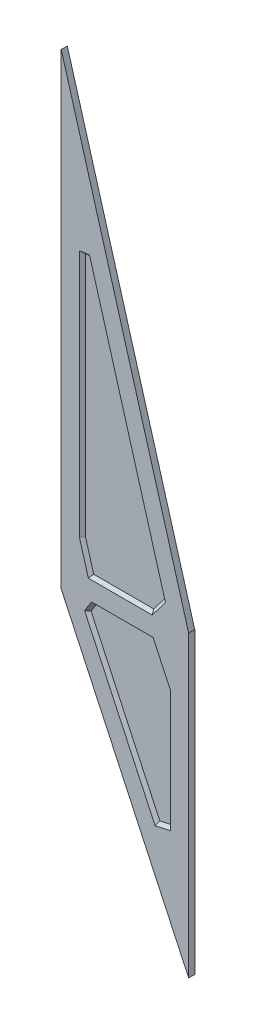
ISO-10303-21;
HEADER;
FILE_DESCRIPTION(('STEP AP214'),'2;1');
FILE_NAME('part.step','',(''),(''),'','','');
FILE_SCHEMA(('AUTOMOTIVE_DESIGN { 1 0 10303 214 1 1 1 1 }'));
ENDSEC;
DATA;
#1=APPLICATION_CONTEXT('core data for automotive mechanical design processes');
#2=APPLICATION_PROTOCOL_DEFINITION('international standard','automotive_design',2000,#1);
#3=PRODUCT_CONTEXT('',#1,'mechanical');
#4=PRODUCT('Part','Part','',(#3));
#5=PRODUCT_RELATED_PRODUCT_CATEGORY('part','',(#4));
#6=PRODUCT_DEFINITION_FORMATION('','',#4);
#7=PRODUCT_DEFINITION_CONTEXT('part definition',#1,'design');
#8=PRODUCT_DEFINITION('design','',#6,#7);
#9=PRODUCT_DEFINITION_SHAPE('','',#8);
#10=(LENGTH_UNIT() NAMED_UNIT(*) SI_UNIT(.MILLI.,.METRE.));
#11=(NAMED_UNIT(*) PLANE_ANGLE_UNIT() SI_UNIT($,.RADIAN.));
#12=(NAMED_UNIT(*) SI_UNIT($,.STERADIAN.) SOLID_ANGLE_UNIT());
#13=UNCERTAINTY_MEASURE_WITH_UNIT(LENGTH_MEASURE(1.E-05),#10,'distance_accuracy_value','');
#14=(GEOMETRIC_REPRESENTATION_CONTEXT(3) GLOBAL_UNCERTAINTY_ASSIGNED_CONTEXT((#13)) GLOBAL_UNIT_ASSIGNED_CONTEXT((#10,
#11,#12)) REPRESENTATION_CONTEXT('',''));
#15=CARTESIAN_POINT('',(0.,0.,0.));
#16=DIRECTION('',(0.,0.,1.));
#17=DIRECTION('',(1.,0.,0.));
#18=AXIS2_PLACEMENT_3D('',#15,#16,#17);
#19=CARTESIAN_POINT('',(0.,0.,10.));
#20=DIRECTION('',(0.,0.,1.));
#21=DIRECTION('',(1.,0.,0.));
#22=AXIS2_PLACEMENT_3D('',#19,#20,#21);
#23=PLANE('',#22);
#24=DIRECTION('',(0.,-1.,0.));
#25=VECTOR('',#24,1.);
#26=CARTESIAN_POINT('',(0.,-450.,10.));
#27=LINE('',#26,#25);
#28=CARTESIAN_POINT('',(0.,42.1417075551608,10.));
#29=VERTEX_POINT('',#28);
#30=CARTESIAN_POINT('',(0.,-450.,10.));
#31=VERTEX_POINT('',#30);
#32=EDGE_CURVE('E158',#29,#31,#27,.T.);
#33=ORIENTED_EDGE('',*,*,#32,.F.);
#34=DIRECTION('',(0.277210869934193,-0.960809103615452,0.));
#35=VECTOR('',#34,1.);
#36=CARTESIAN_POINT('',(11.2243058966378,3.23841602905938,10.));
#37=LINE('',#36,#35);
#38=CARTESIAN_POINT('',(-210.,769.998850412304,10.));
#39=VERTEX_POINT('',#38);
#40=EDGE_CURVE('E185',#39,#29,#37,.T.);
#41=ORIENTED_EDGE('',*,*,#40,.F.);
#42=DIRECTION('',(0.,-1.,0.));
#43=VECTOR('',#42,1.);
#44=CARTESIAN_POINT('',(-209.999999999999,0.,10.));
#45=LINE('',#44,#43);
#46=CARTESIAN_POINT('',(-209.999999999999,0.,10.));
#47=VERTEX_POINT('',#46);
#48=EDGE_CURVE('E268',#39,#47,#45,.T.);
#49=ORIENTED_EDGE('',*,*,#48,.T.);
#50=DIRECTION('',(-0.422885465331123,0.906183139995266,0.));
#51=VECTOR('',#50,1.);
#52=CARTESIAN_POINT('',(-172.445255474452,-80.4744525547442,10.));
#53=LINE('',#52,#51);
#54=EDGE_CURVE('E189',#31,#47,#53,.T.);
#55=ORIENTED_EDGE('',*,*,#54,.F.);
#56=EDGE_LOOP('',(#33,#41,#49,#55));
#57=FACE_BOUND('',#56,.T.);
#58=DIRECTION('',(1.,0.,0.));
#59=VECTOR('',#58,1.);
#60=CARTESIAN_POINT('',(-160.,6.6554801024863,10.));
#61=LINE('',#60,#59);
#62=CARTESIAN_POINT('',(-160.,6.6554801024863,10.));
#63=VERTEX_POINT('',#62);
#64=CARTESIAN_POINT('',(-58.6117340468559,6.65548010248633,10.));
#65=VERTEX_POINT('',#64);
#66=EDGE_CURVE('E237',#63,#65,#61,.T.);
#67=ORIENTED_EDGE('',*,*,#66,.T.);
#68=DIRECTION('',(0.422885465331123,-0.906183139995266,0.));
#69=VECTOR('',#68,1.);
#70=CARTESIAN_POINT('',(-58.6117340468559,6.65548010248632,10.));
#71=LINE('',#70,#69);
#72=CARTESIAN_POINT('',(-30.,-54.6553785693479,10.));
#73=VERTEX_POINT('',#72);
#74=EDGE_CURVE('E280',#65,#73,#71,.T.);
#75=ORIENTED_EDGE('',*,*,#74,.T.);
#76=DIRECTION('',(0.,-1.,0.));
#77=VECTOR('',#76,1.);
#78=CARTESIAN_POINT('',(-30.,-54.6553785693479,10.));
#79=LINE('',#78,#77);
#80=CARTESIAN_POINT('',(-30.,-254.773091326085,10.));
#81=VERTEX_POINT('',#80);
#82=EDGE_CURVE('E283',#73,#81,#79,.T.);
#83=ORIENTED_EDGE('',*,*,#82,.T.);
#84=DIRECTION('',(-0.976264088245405,-0.216583540469647,0.));
#85=VECTOR('',#84,1.);
#86=CARTESIAN_POINT('',(-55.3731279198674,-260.402102926369,10.));
#87=LINE('',#86,#85);
#88=CARTESIAN_POINT('',(-55.3731279198674,-260.402102926369,10.));
#89=VERTEX_POINT('',#88);
#90=EDGE_CURVE('E286',#81,#89,#87,.T.);
#91=ORIENTED_EDGE('',*,*,#90,.T.);
#92=DIRECTION('',(-0.422885465331123,0.906183139995266,0.));
#93=VECTOR('',#92,1.);
#94=CARTESIAN_POINT('',(-55.3731279198674,-260.402102926369,10.));
#95=LINE('',#94,#93);
#96=CARTESIAN_POINT('',(-171.542290693377,-11.468182697419,10.));
#97=VERTEX_POINT('',#96);
#98=EDGE_CURVE('E289',#89,#97,#95,.T.);
#99=ORIENTED_EDGE('',*,*,#98,.T.);
#100=DIRECTION('',(0.53717526686775,0.843470647186707,0.));
#101=VECTOR('',#100,1.);
#102=CARTESIAN_POINT('',(-171.542290693377,-11.468182697419,10.));
#103=LINE('',#102,#101);
#104=EDGE_CURVE('E292',#97,#63,#103,.T.);
#105=ORIENTED_EDGE('',*,*,#104,.T.);
#106=EDGE_LOOP('',(#67,#75,#83,#91,#99,#105));
#107=FACE_BOUND('',#106,.T.);
#108=DIRECTION('',(0.277210869934193,-0.960809103615452,0.));
#109=VECTOR('',#108,1.);
#110=CARTESIAN_POINT('',(-163.367347803948,500.149847833662,10.));
#111=LINE('',#110,#109);
#112=CARTESIAN_POINT('',(-163.367347803948,500.149847833662,10.));
#113=VERTEX_POINT('',#112);
#114=CARTESIAN_POINT('',(-38.3163260980258,66.72470797538,10.));
#115=VERTEX_POINT('',#114);
#116=EDGE_CURVE('E263',#113,#115,#111,.T.);
#117=ORIENTED_EDGE('',*,*,#116,.T.);
#118=DIRECTION('',(-0.601161014232379,-0.799127921528898,0.));
#119=VECTOR('',#118,1.);
#120=CARTESIAN_POINT('',(-38.3163260980258,66.72470797538,10.));
#121=LINE('',#120,#119);
#122=CARTESIAN_POINT('',(-60.,37.9004348669165,10.));
#123=VERTEX_POINT('',#122);
#124=EDGE_CURVE('E261',#115,#123,#121,.T.);
#125=ORIENTED_EDGE('',*,*,#124,.T.);
#126=DIRECTION('',(-1.,0.,0.));
#127=VECTOR('',#126,1.);
#128=CARTESIAN_POINT('',(-60.,37.9004348669165,10.));
#129=LINE('',#128,#127);
#130=CARTESIAN_POINT('',(-165.302631408071,37.9004348669165,10.));
#131=VERTEX_POINT('',#130);
#132=EDGE_CURVE('E248',#123,#131,#129,.T.);
#133=ORIENTED_EDGE('',*,*,#132,.T.);
#134=DIRECTION('',(-0.277210869934193,0.960809103615451,0.));
#135=VECTOR('',#134,1.);
#136=CARTESIAN_POINT('',(-180.,88.8413144423438,10.));
#137=LINE('',#136,#135);
#138=CARTESIAN_POINT('',(-180.,88.8413144423438,10.));
#139=VERTEX_POINT('',#138);
#140=EDGE_CURVE('E254',#131,#139,#137,.T.);
#141=ORIENTED_EDGE('',*,*,#140,.T.);
#142=DIRECTION('',(0.,1.,0.));
#143=VECTOR('',#142,1.);
#144=CARTESIAN_POINT('',(-180.,88.8413144423438,10.));
#145=LINE('',#144,#143);
#146=CARTESIAN_POINT('',(-180.,497.798394050589,10.));
#147=VERTEX_POINT('',#146);
#148=EDGE_CURVE('E182',#139,#147,#145,.T.);
#149=ORIENTED_EDGE('',*,*,#148,.T.);
#150=DIRECTION('',(0.990153802097293,0.139983742599902,0.));
#151=VECTOR('',#150,1.);
#152=CARTESIAN_POINT('',(-180.,497.798394050589,10.));
#153=LINE('',#152,#151);
#154=EDGE_CURVE('E178',#147,#113,#153,.T.);
#155=ORIENTED_EDGE('',*,*,#154,.T.);
#156=EDGE_LOOP('',(#117,#125,#133,#141,#149,#155));
#157=FACE_BOUND('',#156,.T.);
#158=ADVANCED_FACE('F37',(#57,#107,#157),#23,.T.);
#159=CARTESIAN_POINT('',(0.,0.,0.));
#160=DIRECTION('',(0.,0.,1.));
#161=DIRECTION('',(1.,0.,0.));
#162=AXIS2_PLACEMENT_3D('',#159,#160,#161);
#163=PLANE('',#162);
#164=DIRECTION('',(0.277210869934193,-0.960809103615452,0.));
#165=VECTOR('',#164,1.);
#166=CARTESIAN_POINT('',(11.2243058966378,3.23841602905938,0.));
#167=LINE('',#166,#165);
#168=CARTESIAN_POINT('',(-210.,769.998850412304,0.));
#169=VERTEX_POINT('',#168);
#170=CARTESIAN_POINT('',(0.,42.1417075551611,0.));
#171=VERTEX_POINT('',#170);
#172=EDGE_CURVE('E170',#169,#171,#167,.T.);
#173=ORIENTED_EDGE('',*,*,#172,.T.);
#174=DIRECTION('',(0.,-1.,0.));
#175=VECTOR('',#174,1.);
#176=CARTESIAN_POINT('',(0.,-450.,0.));
#177=LINE('',#176,#175);
#178=CARTESIAN_POINT('',(0.,-450.,0.));
#179=VERTEX_POINT('',#178);
#180=EDGE_CURVE('E155',#171,#179,#177,.T.);
#181=ORIENTED_EDGE('',*,*,#180,.T.);
#182=DIRECTION('',(-0.422885465331123,0.906183139995266,0.));
#183=VECTOR('',#182,1.);
#184=CARTESIAN_POINT('',(-172.445255474452,-80.4744525547442,0.));
#185=LINE('',#184,#183);
#186=CARTESIAN_POINT('',(-209.999999999999,0.,0.));
#187=VERTEX_POINT('',#186);
#188=EDGE_CURVE('E169',#179,#187,#185,.T.);
#189=ORIENTED_EDGE('',*,*,#188,.T.);
#190=DIRECTION('',(0.,-1.,0.));
#191=VECTOR('',#190,1.);
#192=CARTESIAN_POINT('',(-209.999999999999,0.,0.));
#193=LINE('',#192,#191);
#194=EDGE_CURVE('E177',#169,#187,#193,.T.);
#195=ORIENTED_EDGE('',*,*,#194,.F.);
#196=EDGE_LOOP('',(#173,#181,#189,#195));
#197=FACE_BOUND('',#196,.T.);
#198=ADVANCED_FACE('F39',(#197),#163,.F.);
#199=CARTESIAN_POINT('',(-172.445255474452,-80.4744525547442,10.));
#200=DIRECTION('',(0.906183139995266,0.422885465331123,0.));
#201=DIRECTION('',(0.422885465331123,-0.906183139995266,0.));
#202=AXIS2_PLACEMENT_3D('',#199,#200,#201);
#203=PLANE('',#202);
#204=ORIENTED_EDGE('',*,*,#188,.F.);
#205=DIRECTION('',(0.,0.,-1.));
#206=VECTOR('',#205,1.);
#207=CARTESIAN_POINT('',(0.,-450.,10.));
#208=LINE('',#207,#206);
#209=EDGE_CURVE('E152',#31,#179,#208,.T.);
#210=ORIENTED_EDGE('',*,*,#209,.F.);
#211=ORIENTED_EDGE('',*,*,#54,.T.);
#212=DIRECTION('',(0.,0.,-1.));
#213=VECTOR('',#212,1.);
#214=CARTESIAN_POINT('',(-209.999999999999,0.,10.));
#215=LINE('',#214,#213);
#216=EDGE_CURVE('E164',#47,#187,#215,.T.);
#217=ORIENTED_EDGE('',*,*,#216,.T.);
#218=EDGE_LOOP('',(#204,#210,#211,#217));
#219=FACE_BOUND('',#218,.T.);
#220=ADVANCED_FACE('F175',(#219),#203,.F.);
#221=CARTESIAN_POINT('',(-209.999999999999,0.,10.));
#222=DIRECTION('',(-1.,0.,0.));
#223=DIRECTION('',(0.,1.,0.));
#224=AXIS2_PLACEMENT_3D('',#221,#222,#223);
#225=PLANE('',#224);
#226=ORIENTED_EDGE('',*,*,#194,.T.);
#227=ORIENTED_EDGE('',*,*,#216,.F.);
#228=ORIENTED_EDGE('',*,*,#48,.F.);
#229=DIRECTION('',(0.,0.,-1.));
#230=VECTOR('',#229,1.);
#231=CARTESIAN_POINT('',(-210.,769.998850412304,10.));
#232=LINE('',#231,#230);
#233=EDGE_CURVE('E192',#39,#169,#232,.T.);
#234=ORIENTED_EDGE('',*,*,#233,.T.);
#235=EDGE_LOOP('',(#226,#227,#228,#234));
#236=FACE_BOUND('',#235,.T.);
#237=ADVANCED_FACE('F413',(#236),#225,.T.);
#238=CARTESIAN_POINT('',(11.2243058966378,3.23841602905938,10.));
#239=DIRECTION('',(-0.960809103615452,-0.277210869934193,0.));
#240=DIRECTION('',(-0.277210869934193,0.960809103615452,0.));
#241=AXIS2_PLACEMENT_3D('',#238,#239,#240);
#242=PLANE('',#241);
#243=ORIENTED_EDGE('',*,*,#172,.F.);
#244=ORIENTED_EDGE('',*,*,#233,.F.);
#245=ORIENTED_EDGE('',*,*,#40,.T.);
#246=DIRECTION('',(0.,0.,-1.));
#247=VECTOR('',#246,1.);
#248=CARTESIAN_POINT('',(0.,42.1417075551611,10.));
#249=LINE('',#248,#247);
#250=EDGE_CURVE('E190',#29,#171,#249,.T.);
#251=ORIENTED_EDGE('',*,*,#250,.T.);
#252=EDGE_LOOP('',(#243,#244,#245,#251));
#253=FACE_BOUND('',#252,.T.);
#254=ADVANCED_FACE('F274',(#253),#242,.F.);
#255=CARTESIAN_POINT('',(0.,0.,5.));
#256=DIRECTION('',(0.,0.,-1.));
#257=DIRECTION('',(1.,0.,0.));
#258=AXIS2_PLACEMENT_3D('',#255,#256,#257);
#259=PLANE('',#258);
#260=DIRECTION('',(0.,1.,0.));
#261=VECTOR('',#260,1.);
#262=CARTESIAN_POINT('',(-175.,497.798394050589,5.));
#263=LINE('',#262,#261);
#264=CARTESIAN_POINT('',(-174.999999999999,89.5481932237181,5.));
#265=VERTEX_POINT('',#264);
#266=CARTESIAN_POINT('',(-175.,493.455552284096,5.));
#267=VERTEX_POINT('',#266);
#268=EDGE_CURVE('E46',#265,#267,#263,.T.);
#269=ORIENTED_EDGE('',*,*,#268,.F.);
#270=DIRECTION('',(-0.277210869934193,0.960809103615452,0.));
#271=VECTOR('',#270,1.);
#272=CARTESIAN_POINT('',(-175.195954481922,90.2273687920148,5.));
#273=LINE('',#272,#271);
#274=CARTESIAN_POINT('',(-161.541274821491,42.9004348669165,5.));
#275=VERTEX_POINT('',#274);
#276=EDGE_CURVE('E222',#275,#265,#273,.T.);
#277=ORIENTED_EDGE('',*,*,#276,.F.);
#278=DIRECTION('',(-1.,0.,0.));
#279=VECTOR('',#278,1.);
#280=CARTESIAN_POINT('',(-165.302631408071,42.9004348669165,5.));
#281=LINE('',#280,#279);
#282=CARTESIAN_POINT('',(-62.495463961543,42.9004348669166,5.));
#283=VERTEX_POINT('',#282);
#284=EDGE_CURVE('E219',#283,#275,#281,.T.);
#285=ORIENTED_EDGE('',*,*,#284,.F.);
#286=DIRECTION('',(-0.601161014232379,-0.799127921528898,0.));
#287=VECTOR('',#286,1.);
#288=CARTESIAN_POINT('',(-63.9956396076446,40.9062399380784,5.));
#289=LINE('',#288,#287);
#290=CARTESIAN_POINT('',(-43.8121413517719,67.7363181177039,5.));
#291=VERTEX_POINT('',#290);
#292=EDGE_CURVE('E216',#291,#283,#289,.T.);
#293=ORIENTED_EDGE('',*,*,#292,.F.);
#294=DIRECTION('',(0.277210869934193,-0.960809103615452,0.));
#295=VECTOR('',#294,1.);
#296=CARTESIAN_POINT('',(-43.1203716161031,65.3386536257091,5.));
#297=LINE('',#296,#295);
#298=CARTESIAN_POINT('',(-166.967510377949,494.591151579183,5.));
#299=VERTEX_POINT('',#298);
#300=EDGE_CURVE('E213',#299,#291,#297,.T.);
#301=ORIENTED_EDGE('',*,*,#300,.F.);
#302=DIRECTION('',(0.990153802097293,0.139983742599902,0.));
#303=VECTOR('',#302,1.);
#304=CARTESIAN_POINT('',(-162.667429090949,495.199078823176,5.));
#305=LINE('',#304,#303);
#306=EDGE_CURVE('E11',#267,#299,#305,.T.);
#307=ORIENTED_EDGE('',*,*,#306,.F.);
#308=EDGE_LOOP('',(#269,#277,#285,#293,#301,#307));
#309=FACE_BOUND('',#308,.T.);
#310=ADVANCED_FACE('F303',(#309),#259,.F.);
#311=CARTESIAN_POINT('',(0.,0.,5.));
#312=DIRECTION('',(0.,0.,1.));
#313=DIRECTION('',(-1.,0.,0.));
#314=AXIS2_PLACEMENT_3D('',#311,#312,#313);
#315=PLANE('',#314);
#316=DIRECTION('',(-0.422885465331123,0.906183139995266,0.));
#317=VECTOR('',#316,1.);
#318=CARTESIAN_POINT('',(-140.728845574618,-65.673461268155,5.));
#319=LINE('',#318,#317);
#320=CARTESIAN_POINT('',(-52.5389633245639,-254.651780375414,5.));
#321=VERTEX_POINT('',#320);
#322=CARTESIAN_POINT('',(-165.851157662245,-11.8399353660965,5.));
#323=VERTEX_POINT('',#322);
#324=EDGE_CURVE('E207',#321,#323,#319,.T.);
#325=ORIENTED_EDGE('',*,*,#324,.F.);
#326=DIRECTION('',(-0.976264088245405,-0.216583540469647,0.));
#327=VECTOR('',#326,1.);
#328=CARTESIAN_POINT('',(51.3797480372209,-231.597483183935,5.));
#329=LINE('',#328,#327);
#330=CARTESIAN_POINT('',(-34.9999999999999,-250.760772994585,5.));
#331=VERTEX_POINT('',#330);
#332=EDGE_CURVE('E204',#331,#321,#329,.T.);
#333=ORIENTED_EDGE('',*,*,#332,.F.);
#334=DIRECTION('',(0.,-1.,0.));
#335=VECTOR('',#334,1.);
#336=CARTESIAN_POINT('',(-34.9999999999999,0.,5.));
#337=LINE('',#336,#335);
#338=CARTESIAN_POINT('',(-34.9999999999999,-55.7646252530957,5.));
#339=VERTEX_POINT('',#338);
#340=EDGE_CURVE('E201',#339,#331,#337,.T.);
#341=ORIENTED_EDGE('',*,*,#340,.F.);
#342=DIRECTION('',(0.422885465331123,-0.906183139995266,0.));
#343=VECTOR('',#342,1.);
#344=CARTESIAN_POINT('',(-50.1105315750913,-23.3849147350426,5.));
#345=LINE('',#344,#343);
#346=CARTESIAN_POINT('',(-61.7960491659382,1.65548010248643,5.));
#347=VERTEX_POINT('',#346);
#348=EDGE_CURVE('E198',#347,#339,#345,.T.);
#349=ORIENTED_EDGE('',*,*,#348,.F.);
#350=DIRECTION('',(1.,0.,0.));
#351=VECTOR('',#350,1.);
#352=CARTESIAN_POINT('',(0.,1.65548010248644,5.));
#353=LINE('',#352,#351);
#354=CARTESIAN_POINT('',(-157.256426559264,1.65548010248641,5.));
#355=VERTEX_POINT('',#354);
#356=EDGE_CURVE('E163',#355,#347,#353,.T.);
#357=ORIENTED_EDGE('',*,*,#356,.F.);
#358=DIRECTION('',(0.53717526686775,0.843470647186707,0.));
#359=VECTOR('',#358,1.);
#360=CARTESIAN_POINT('',(-112.62902591928,71.7292620164545,5.));
#361=LINE('',#360,#359);
#362=EDGE_CURVE('E210',#323,#355,#361,.T.);
#363=ORIENTED_EDGE('',*,*,#362,.F.);
#364=EDGE_LOOP('',(#325,#333,#341,#349,#357,#363));
#365=FACE_BOUND('',#364,.T.);
#366=ADVANCED_FACE('F389',(#365),#315,.T.);
#367=CARTESIAN_POINT('',(-34.9999999999999,0.,5.));
#368=DIRECTION('',(0.70710678118654,0.,-0.707106781186555));
#369=DIRECTION('',(0.,-1.,0.));
#370=AXIS2_PLACEMENT_3D('',#367,#368,#369);
#371=PLANE('',#370);
#372=DIRECTION('',(-0.698563695288747,-0.154975892477128,-0.698563695288732));
#373=VECTOR('',#372,1.);
#374=CARTESIAN_POINT('',(-28.962891996098,-54.4252968465446,11.0371080039018));
#375=LINE('',#374,#373);
#376=EDGE_CURVE('E233',#73,#339,#375,.T.);
#377=ORIENTED_EDGE('',*,*,#376,.T.);
#378=ORIENTED_EDGE('',*,*,#340,.T.);
#379=DIRECTION('',(-0.614997783554434,0.493513376157409,-0.614997783554421));
#380=VECTOR('',#379,1.);
#381=CARTESIAN_POINT('',(-8.14549833684376,-272.310534855858,31.8545016631556));
#382=LINE('',#381,#380);
#383=EDGE_CURVE('E235',#331,#81,#382,.F.);
#384=ORIENTED_EDGE('',*,*,#383,.T.);
#385=ORIENTED_EDGE('',*,*,#82,.F.);
#386=EDGE_LOOP('',(#377,#378,#384,#385));
#387=FACE_BOUND('',#386,.T.);
#388=ADVANCED_FACE('F382',(#387),#371,.F.);
#389=CARTESIAN_POINT('',(51.3797480372209,-231.597483183935,5.));
#390=DIRECTION('',(0.153147690159478,-0.690322957027223,-0.707106781186553));
#391=DIRECTION('',(-0.976264088245405,-0.216583540469647,0.));
#392=AXIS2_PLACEMENT_3D('',#389,#390,#391);
#393=PLANE('',#392);
#394=ORIENTED_EDGE('',*,*,#383,.F.);
#395=ORIENTED_EDGE('',*,*,#332,.T.);
#396=DIRECTION('',(0.348600988868023,0.707287124712012,-0.614997783554421));
#397=VECTOR('',#396,1.);
#398=CARTESIAN_POINT('',(-16.6613498160979,-181.858601611545,-58.2948657391279));
#399=LINE('',#398,#397);
#400=EDGE_CURVE('E231',#321,#89,#399,.F.);
#401=ORIENTED_EDGE('',*,*,#400,.T.);
#402=ORIENTED_EDGE('',*,*,#90,.F.);
#403=EDGE_LOOP('',(#394,#395,#401,#402));
#404=FACE_BOUND('',#403,.T.);
#405=ADVANCED_FACE('F374',(#404),#393,.F.);
#406=CARTESIAN_POINT('',(-50.1105315750913,-23.3849147350426,5.));
#407=DIRECTION('',(0.640768243287563,0.299025180200862,-0.707106781186556));
#408=DIRECTION('',(0.422885465331123,-0.906183139995266,0.));
#409=AXIS2_PLACEMENT_3D('',#406,#407,#408);
#410=PLANE('',#409);
#411=ORIENTED_EDGE('',*,*,#376,.F.);
#412=ORIENTED_EDGE('',*,*,#74,.F.);
#413=DIRECTION('',(-0.410615011450011,-0.644746195169823,-0.644746195169808));
#414=VECTOR('',#413,1.);
#415=CARTESIAN_POINT('',(-66.4550720094747,-5.66010059431232,-2.31558069679859));
#416=LINE('',#415,#414);
#417=EDGE_CURVE('E229',#65,#347,#416,.T.);
#418=ORIENTED_EDGE('',*,*,#417,.T.);
#419=ORIENTED_EDGE('',*,*,#348,.T.);
#420=EDGE_LOOP('',(#411,#412,#418,#419));
#421=FACE_BOUND('',#420,.T.);
#422=ADVANCED_FACE('F366',(#421),#410,.F.);
#423=CARTESIAN_POINT('',(-140.728845574618,-65.673461268155,5.));
#424=DIRECTION('',(-0.640768243287566,-0.299025180200863,-0.707106781186553));
#425=DIRECTION('',(-0.422885465331123,0.906183139995266,0.));
#426=AXIS2_PLACEMENT_3D('',#423,#424,#425);
#427=PLANE('',#426);
#428=ORIENTED_EDGE('',*,*,#400,.F.);
#429=ORIENTED_EDGE('',*,*,#324,.T.);
#430=DIRECTION('',(0.750346977206663,-0.0490137007314369,-0.659224598249665));
#431=VECTOR('',#430,1.);
#432=CARTESIAN_POINT('',(-138.959449803496,-13.5965388591269,-18.6259701817243));
#433=LINE('',#432,#431);
#434=EDGE_CURVE('E227',#323,#97,#433,.F.);
#435=ORIENTED_EDGE('',*,*,#434,.T.);
#436=ORIENTED_EDGE('',*,*,#98,.F.);
#437=EDGE_LOOP('',(#428,#429,#435,#436));
#438=FACE_BOUND('',#437,.T.);
#439=ADVANCED_FACE('F358',(#438),#427,.F.);
#440=CARTESIAN_POINT('',(0.,1.65548010248644,5.));
#441=DIRECTION('',(0.,0.70710678118654,-0.707106781186555));
#442=DIRECTION('',(1.,0.,0.));
#443=AXIS2_PLACEMENT_3D('',#440,#441,#442);
#444=PLANE('',#443);
#445=ORIENTED_EDGE('',*,*,#417,.F.);
#446=ORIENTED_EDGE('',*,*,#66,.F.);
#447=DIRECTION('',(-0.36172621984744,0.659224598249679,0.659224598249664));
#448=VECTOR('',#447,1.);
#449=CARTESIAN_POINT('',(-168.12682751179,21.4661416126302,24.8106615101434));
#450=LINE('',#449,#448);
#451=EDGE_CURVE('E225',#63,#355,#450,.F.);
#452=ORIENTED_EDGE('',*,*,#451,.T.);
#453=ORIENTED_EDGE('',*,*,#356,.T.);
#454=EDGE_LOOP('',(#445,#446,#452,#453));
#455=FACE_BOUND('',#454,.T.);
#456=ADVANCED_FACE('F350',(#455),#444,.F.);
#457=CARTESIAN_POINT('',(-112.62902591928,71.7292620164545,5.));
#458=DIRECTION('',(-0.59642381435752,0.379840273887875,-0.707106781186555));
#459=DIRECTION('',(0.53717526686775,0.843470647186707,0.));
#460=AXIS2_PLACEMENT_3D('',#457,#458,#459);
#461=PLANE('',#460);
#462=ORIENTED_EDGE('',*,*,#434,.F.);
#463=ORIENTED_EDGE('',*,*,#362,.T.);
#464=ORIENTED_EDGE('',*,*,#451,.F.);
#465=ORIENTED_EDGE('',*,*,#104,.F.);
#466=EDGE_LOOP('',(#462,#463,#464,#465));
#467=FACE_BOUND('',#466,.T.);
#468=ADVANCED_FACE('F322',(#467),#461,.F.);
#469=CARTESIAN_POINT('',(0.,42.9004348669166,5.));
#470=DIRECTION('',(0.,0.707106781186543,0.707106781186552));
#471=DIRECTION('',(1.,0.,0.));
#472=AXIS2_PLACEMENT_3D('',#469,#470,#471);
#473=PLANE('',#472);
#474=DIRECTION('',(-0.33279556624622,0.666800986459554,-0.666800986459546));
#475=VECTOR('',#474,1.);
#476=CARTESIAN_POINT('',(-55.573910783835,29.0321657106101,18.8682691563063));
#477=LINE('',#476,#475);
#478=EDGE_CURVE('E242',#123,#283,#477,.T.);
#479=ORIENTED_EDGE('',*,*,#478,.T.);
#480=ORIENTED_EDGE('',*,*,#284,.T.);
#481=DIRECTION('',(0.469627600564066,0.624279551478521,-0.624279551478514));
#482=VECTOR('',#481,1.);
#483=CARTESIAN_POINT('',(-180.50860969923,17.6870119420387,30.2134229248775));
#484=LINE('',#483,#482);
#485=EDGE_CURVE('E41',#275,#131,#484,.F.);
#486=ORIENTED_EDGE('',*,*,#485,.T.);
#487=ORIENTED_EDGE('',*,*,#132,.F.);
#488=EDGE_LOOP('',(#479,#480,#486,#487));
#489=FACE_BOUND('',#488,.T.);
#490=ADVANCED_FACE('F246',(#489),#473,.T.);
#491=CARTESIAN_POINT('',(-137.701105163757,-39.7292688107406,5.));
#492=DIRECTION('',(0.679394632592248,0.196017685949088,0.707106781186554));
#493=DIRECTION('',(0.277210869934193,-0.960809103615452,0.));
#494=AXIS2_PLACEMENT_3D('',#491,#492,#493);
#495=PLANE('',#494);
#496=ORIENTED_EDGE('',*,*,#485,.F.);
#497=ORIENTED_EDGE('',*,*,#276,.T.);
#498=DIRECTION('',(0.703599790599631,0.0994719525108513,-0.703599790599624));
#499=VECTOR('',#498,1.);
#500=CARTESIAN_POINT('',(-181.267338792452,88.6621434621044,11.2673387924523));
#501=LINE('',#500,#499);
#502=EDGE_CURVE('E61',#265,#139,#501,.F.);
#503=ORIENTED_EDGE('',*,*,#502,.T.);
#504=ORIENTED_EDGE('',*,*,#140,.F.);
#505=EDGE_LOOP('',(#496,#497,#503,#504));
#506=FACE_BOUND('',#505,.T.);
#507=ADVANCED_FACE('F255',(#506),#495,.T.);
#508=CARTESIAN_POINT('',(-60.5195071312293,45.5270893529127,5.));
#509=DIRECTION('',(-0.565068772348593,0.425085029748696,0.70710678118655));
#510=DIRECTION('',(0.601161014232379,0.799127921528898,0.));
#511=AXIS2_PLACEMENT_3D('',#508,#509,#510);
#512=PLANE('',#511);
#513=ORIENTED_EDGE('',*,*,#478,.F.);
#514=ORIENTED_EDGE('',*,*,#124,.F.);
#515=DIRECTION('',(-0.732923006519458,0.134908528162801,-0.666800986459547));
#516=VECTOR('',#515,1.);
#517=CARTESIAN_POINT('',(-50.5909450618577,68.9840868779931,-1.16724125275614));
#518=LINE('',#517,#516);
#519=EDGE_CURVE('E240',#115,#291,#518,.T.);
#520=ORIENTED_EDGE('',*,*,#519,.T.);
#521=ORIENTED_EDGE('',*,*,#292,.T.);
#522=EDGE_LOOP('',(#513,#514,#520,#521));
#523=FACE_BOUND('',#522,.T.);
#524=ADVANCED_FACE('F300',(#523),#512,.T.);
#525=CARTESIAN_POINT('',(-174.999999999999,0.,5.));
#526=DIRECTION('',(0.707106781186544,0.,0.707106781186551));
#527=DIRECTION('',(0.,-1.,0.));
#528=AXIS2_PLACEMENT_3D('',#525,#526,#527);
#529=PLANE('',#528);
#530=ORIENTED_EDGE('',*,*,#502,.F.);
#531=ORIENTED_EDGE('',*,*,#268,.T.);
#532=DIRECTION('',(0.602539647693684,-0.523346869594487,-0.602539647693678));
#533=VECTOR('',#532,1.);
#534=CARTESIAN_POINT('',(-142.141493853833,464.915693708864,-27.8585061461667));
#535=LINE('',#534,#533);
#536=EDGE_CURVE('E53',#267,#147,#535,.F.);
#537=ORIENTED_EDGE('',*,*,#536,.T.);
#538=ORIENTED_EDGE('',*,*,#148,.F.);
#539=EDGE_LOOP('',(#530,#531,#537,#538));
#540=FACE_BOUND('',#539,.T.);
#541=ADVANCED_FACE('F304',(#540),#529,.T.);
#542=CARTESIAN_POINT('',(-22.4040127299031,-6.46396441863739,5.));
#543=DIRECTION('',(-0.679394632592252,-0.19601768594909,0.707106781186549));
#544=DIRECTION('',(-0.277210869934193,0.960809103615452,0.));
#545=AXIS2_PLACEMENT_3D('',#542,#543,#544);
#546=PLANE('',#545);
#547=ORIENTED_EDGE('',*,*,#519,.F.);
#548=ORIENTED_EDGE('',*,*,#116,.F.);
#549=DIRECTION('',(0.433848137795709,0.669866976562044,0.602539647693677));
#550=VECTOR('',#549,1.);
#551=CARTESIAN_POINT('',(-145.150255032395,528.277267991859,35.3003751873742));
#552=LINE('',#551,#550);
#553=EDGE_CURVE('E172',#113,#299,#552,.F.);
#554=ORIENTED_EDGE('',*,*,#553,.T.);
#555=ORIENTED_EDGE('',*,*,#300,.T.);
#556=EDGE_LOOP('',(#547,#548,#554,#555));
#557=FACE_BOUND('',#556,.T.);
#558=ADVANCED_FACE('F296',(#557),#546,.T.);
#559=CARTESIAN_POINT('',(-71.8248248949169,508.042020693365,5.));
#560=DIRECTION('',(0.0989834536482626,-0.700144467880634,0.707106781186552));
#561=DIRECTION('',(-0.990153802097293,-0.139983742599902,0.));
#562=AXIS2_PLACEMENT_3D('',#559,#560,#561);
#563=PLANE('',#562);
#564=ORIENTED_EDGE('',*,*,#536,.F.);
#565=ORIENTED_EDGE('',*,*,#306,.T.);
#566=ORIENTED_EDGE('',*,*,#553,.F.);
#567=ORIENTED_EDGE('',*,*,#154,.F.);
#568=EDGE_LOOP('',(#564,#565,#566,#567));
#569=FACE_BOUND('',#568,.T.);
#570=ADVANCED_FACE('F305',(#569),#563,.T.);
#571=CARTESIAN_POINT('',(0.,-450.,0.));
#572=DIRECTION('',(-1.,0.,0.));
#573=DIRECTION('',(0.,0.,1.));
#574=AXIS2_PLACEMENT_3D('',#571,#572,#573);
#575=PLANE('',#574);
#576=ORIENTED_EDGE('',*,*,#32,.T.);
#577=ORIENTED_EDGE('',*,*,#209,.T.);
#578=ORIENTED_EDGE('',*,*,#180,.F.);
#579=ORIENTED_EDGE('',*,*,#250,.F.);
#580=EDGE_LOOP('',(#576,#577,#578,#579));
#581=FACE_BOUND('',#580,.T.);
#582=ADVANCED_FACE('F154',(#581),#575,.F.);
#583=CLOSED_SHELL('',(#158,#198,#220,#237,#254,#310,#366,#388,#405,#422,#439,#456,#468,#490,
#507,#524,#541,#558,#570,#582));
#584=MANIFOLD_SOLID_BREP('B2',#583);
#585=ADVANCED_BREP_SHAPE_REPRESENTATION('',(#18,#584),#14);
#586=SHAPE_DEFINITION_REPRESENTATION(#9,#585);
ENDSEC;
END-ISO-10303-21;
